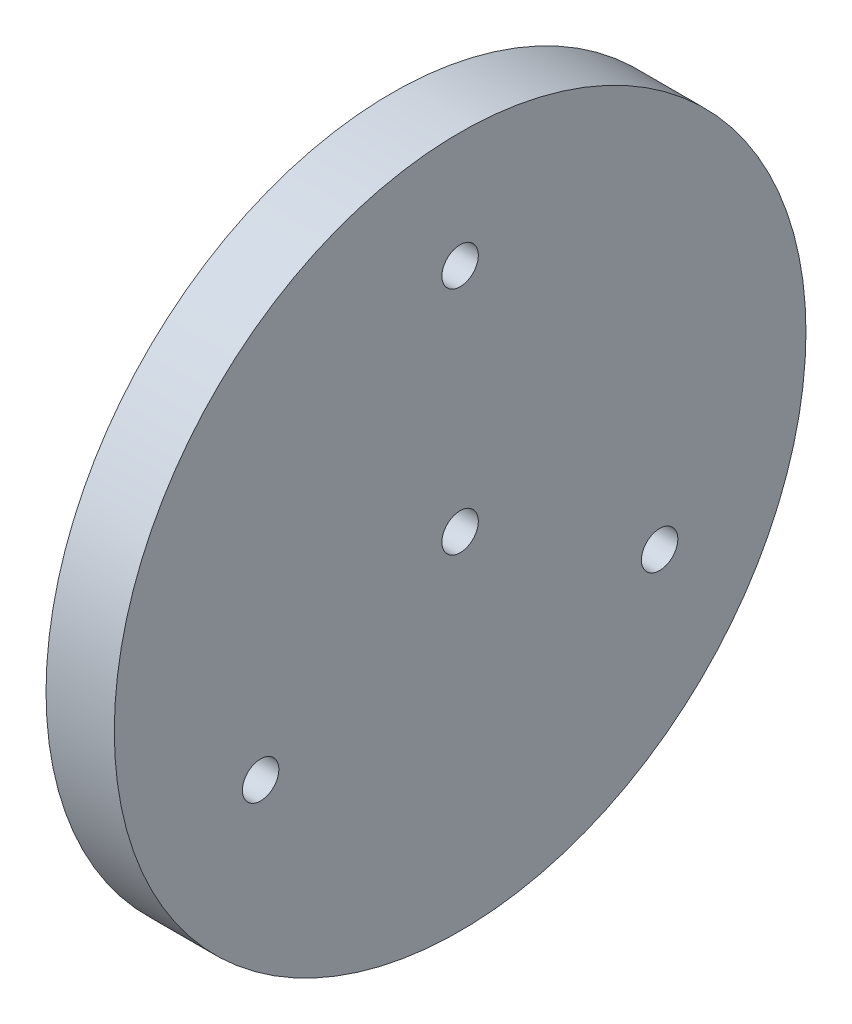
ISO-10303-21;
HEADER;
FILE_DESCRIPTION(('STEP AP214'),'2;1');
FILE_NAME('part.step','',(''),(''),'','','');
FILE_SCHEMA(('AUTOMOTIVE_DESIGN { 1 0 10303 214 1 1 1 1 }'));
ENDSEC;
DATA;
#1=APPLICATION_CONTEXT('core data for automotive mechanical design processes');
#2=APPLICATION_PROTOCOL_DEFINITION('international standard','automotive_design',2000,#1);
#3=PRODUCT_CONTEXT('',#1,'mechanical');
#4=PRODUCT('Part','Part','',(#3));
#5=PRODUCT_RELATED_PRODUCT_CATEGORY('part','',(#4));
#6=PRODUCT_DEFINITION_FORMATION('','',#4);
#7=PRODUCT_DEFINITION_CONTEXT('part definition',#1,'design');
#8=PRODUCT_DEFINITION('design','',#6,#7);
#9=PRODUCT_DEFINITION_SHAPE('','',#8);
#10=(LENGTH_UNIT() NAMED_UNIT(*) SI_UNIT(.MILLI.,.METRE.));
#11=(NAMED_UNIT(*) PLANE_ANGLE_UNIT() SI_UNIT($,.RADIAN.));
#12=(NAMED_UNIT(*) SI_UNIT($,.STERADIAN.) SOLID_ANGLE_UNIT());
#13=UNCERTAINTY_MEASURE_WITH_UNIT(LENGTH_MEASURE(1.E-05),#10,'distance_accuracy_value','');
#14=(GEOMETRIC_REPRESENTATION_CONTEXT(3) GLOBAL_UNCERTAINTY_ASSIGNED_CONTEXT((#13)) GLOBAL_UNIT_ASSIGNED_CONTEXT((#10,
#11,#12)) REPRESENTATION_CONTEXT('',''));
#15=CARTESIAN_POINT('',(0.,0.,0.));
#16=DIRECTION('',(0.,0.,1.));
#17=DIRECTION('',(1.,0.,0.));
#18=AXIS2_PLACEMENT_3D('',#15,#16,#17);
#19=CARTESIAN_POINT('',(15.,0.,0.));
#20=DIRECTION('',(1.,0.,0.));
#21=DIRECTION('',(0.,0.,-1.));
#22=AXIS2_PLACEMENT_3D('',#19,#20,#21);
#23=PLANE('',#22);
#24=CARTESIAN_POINT('',(15.,-25.3097861058362,-43.8378354640156));
#25=DIRECTION('',(1.,0.,0.));
#26=DIRECTION('',(0.,0.,-1.));
#27=AXIS2_PLACEMENT_3D('',#24,#25,#26);
#28=CIRCLE('',#27,4.00000000000277);
#29=CARTESIAN_POINT('',(15.,-25.3097861058362,-47.8378354640183));
#30=VERTEX_POINT('',#29);
#31=EDGE_CURVE('E54',#30,#30,#28,.T.);
#32=ORIENTED_EDGE('',*,*,#31,.F.);
#33=EDGE_LOOP('',(#32));
#34=FACE_BOUND('',#33,.T.);
#35=CARTESIAN_POINT('',(15.,0.,0.));
#36=DIRECTION('',(1.,0.,0.));
#37=DIRECTION('',(0.,0.,-1.));
#38=AXIS2_PLACEMENT_3D('',#35,#36,#37);
#39=CIRCLE('',#38,4.);
#40=CARTESIAN_POINT('',(15.,0.,-4.));
#41=VERTEX_POINT('',#40);
#42=EDGE_CURVE('E43',#41,#41,#39,.T.);
#43=ORIENTED_EDGE('',*,*,#42,.F.);
#44=EDGE_LOOP('',(#43));
#45=FACE_BOUND('',#44,.T.);
#46=CARTESIAN_POINT('',(15.,0.,0.));
#47=DIRECTION('',(1.,0.,0.));
#48=DIRECTION('',(0.,0.,-1.));
#49=AXIS2_PLACEMENT_3D('',#46,#47,#48);
#50=CIRCLE('',#49,76.);
#51=CARTESIAN_POINT('',(15.,0.,-76.));
#52=VERTEX_POINT('',#51);
#53=EDGE_CURVE('E10',#52,#52,#50,.T.);
#54=ORIENTED_EDGE('',*,*,#53,.T.);
#55=EDGE_LOOP('',(#54));
#56=FACE_BOUND('',#55,.T.);
#57=CARTESIAN_POINT('',(15.,50.6195722116761,0.));
#58=DIRECTION('',(1.,0.,0.));
#59=DIRECTION('',(0.,0.,-1.));
#60=AXIS2_PLACEMENT_3D('',#57,#58,#59);
#61=CIRCLE('',#60,4.);
#62=CARTESIAN_POINT('',(15.,50.6195722116761,-4.));
#63=VERTEX_POINT('',#62);
#64=EDGE_CURVE('E48',#63,#63,#61,.T.);
#65=ORIENTED_EDGE('',*,*,#64,.F.);
#66=EDGE_LOOP('',(#65));
#67=FACE_BOUND('',#66,.T.);
#68=CARTESIAN_POINT('',(15.,-25.3097861058399,43.8378354640091));
#69=DIRECTION('',(1.,0.,0.));
#70=DIRECTION('',(0.,0.,-1.));
#71=AXIS2_PLACEMENT_3D('',#68,#69,#70);
#72=CIRCLE('',#71,4.00000000000409);
#73=CARTESIAN_POINT('',(15.,-25.3097861058399,39.837835464005));
#74=VERTEX_POINT('',#73);
#75=EDGE_CURVE('E60',#74,#74,#72,.T.);
#76=ORIENTED_EDGE('',*,*,#75,.F.);
#77=EDGE_LOOP('',(#76));
#78=FACE_BOUND('',#77,.T.);
#79=ADVANCED_FACE('F32',(#34,#45,#56,#67,#78),#23,.T.);
#80=CARTESIAN_POINT('',(0.,0.,0.));
#81=DIRECTION('',(1.,0.,0.));
#82=DIRECTION('',(0.,0.,-1.));
#83=AXIS2_PLACEMENT_3D('',#80,#81,#82);
#84=PLANE('',#83);
#85=CARTESIAN_POINT('',(0.,0.,0.));
#86=DIRECTION('',(1.,0.,0.));
#87=DIRECTION('',(0.,0.,-1.));
#88=AXIS2_PLACEMENT_3D('',#85,#86,#87);
#89=CIRCLE('',#88,76.);
#90=CARTESIAN_POINT('',(0.,0.,-76.));
#91=VERTEX_POINT('',#90);
#92=EDGE_CURVE('E36',#91,#91,#89,.T.);
#93=ORIENTED_EDGE('',*,*,#92,.F.);
#94=EDGE_LOOP('',(#93));
#95=FACE_BOUND('',#94,.T.);
#96=CARTESIAN_POINT('',(0.,0.,0.));
#97=DIRECTION('',(1.,0.,0.));
#98=DIRECTION('',(0.,0.,-1.));
#99=AXIS2_PLACEMENT_3D('',#96,#97,#98);
#100=CIRCLE('',#99,4.);
#101=CARTESIAN_POINT('',(0.,0.,-4.));
#102=VERTEX_POINT('',#101);
#103=EDGE_CURVE('E45',#102,#102,#100,.T.);
#104=ORIENTED_EDGE('',*,*,#103,.T.);
#105=EDGE_LOOP('',(#104));
#106=FACE_BOUND('',#105,.T.);
#107=CARTESIAN_POINT('',(0.,50.6195722116761,0.));
#108=DIRECTION('',(1.,0.,0.));
#109=DIRECTION('',(0.,0.,-1.));
#110=AXIS2_PLACEMENT_3D('',#107,#108,#109);
#111=CIRCLE('',#110,4.);
#112=CARTESIAN_POINT('',(0.,50.6195722116761,-4.));
#113=VERTEX_POINT('',#112);
#114=EDGE_CURVE('E51',#113,#113,#111,.T.);
#115=ORIENTED_EDGE('',*,*,#114,.T.);
#116=EDGE_LOOP('',(#115));
#117=FACE_BOUND('',#116,.T.);
#118=CARTESIAN_POINT('',(0.,-25.3097861058362,-43.8378354640156));
#119=DIRECTION('',(1.,0.,0.));
#120=DIRECTION('',(0.,0.,-1.));
#121=AXIS2_PLACEMENT_3D('',#118,#119,#120);
#122=CIRCLE('',#121,4.00000000000277);
#123=CARTESIAN_POINT('',(0.,-25.3097861058362,-47.8378354640183));
#124=VERTEX_POINT('',#123);
#125=EDGE_CURVE('E57',#124,#124,#122,.T.);
#126=ORIENTED_EDGE('',*,*,#125,.T.);
#127=EDGE_LOOP('',(#126));
#128=FACE_BOUND('',#127,.T.);
#129=CARTESIAN_POINT('',(0.,-25.3097861058399,43.8378354640091));
#130=DIRECTION('',(1.,0.,0.));
#131=DIRECTION('',(0.,0.,-1.));
#132=AXIS2_PLACEMENT_3D('',#129,#130,#131);
#133=CIRCLE('',#132,4.00000000000409);
#134=CARTESIAN_POINT('',(0.,-25.3097861058399,39.837835464005));
#135=VERTEX_POINT('',#134);
#136=EDGE_CURVE('E63',#135,#135,#133,.T.);
#137=ORIENTED_EDGE('',*,*,#136,.T.);
#138=EDGE_LOOP('',(#137));
#139=FACE_BOUND('',#138,.T.);
#140=ADVANCED_FACE('F73',(#95,#106,#117,#128,#139),#84,.F.);
#141=CARTESIAN_POINT('',(15.,0.,0.));
#142=DIRECTION('',(-1.,0.,0.));
#143=DIRECTION('',(0.,0.,1.));
#144=AXIS2_PLACEMENT_3D('',#141,#142,#143);
#145=CYLINDRICAL_SURFACE('',#144,76.);
#146=ORIENTED_EDGE('',*,*,#53,.F.);
#147=EDGE_LOOP('',(#146));
#148=FACE_BOUND('',#147,.T.);
#149=ORIENTED_EDGE('',*,*,#92,.T.);
#150=EDGE_LOOP('',(#149));
#151=FACE_BOUND('',#150,.T.);
#152=ADVANCED_FACE('F34',(#148,#151),#145,.T.);
#153=CARTESIAN_POINT('',(15.,0.,0.));
#154=DIRECTION('',(-1.,0.,0.));
#155=DIRECTION('',(0.,0.,1.));
#156=AXIS2_PLACEMENT_3D('',#153,#154,#155);
#157=CYLINDRICAL_SURFACE('',#156,4.);
#158=ORIENTED_EDGE('',*,*,#42,.T.);
#159=EDGE_LOOP('',(#158));
#160=FACE_BOUND('',#159,.T.);
#161=ORIENTED_EDGE('',*,*,#103,.F.);
#162=EDGE_LOOP('',(#161));
#163=FACE_BOUND('',#162,.T.);
#164=ADVANCED_FACE('F83',(#160,#163),#157,.F.);
#165=CARTESIAN_POINT('',(15.,50.6195722116761,0.));
#166=DIRECTION('',(-1.,0.,0.));
#167=DIRECTION('',(0.,0.,1.));
#168=AXIS2_PLACEMENT_3D('',#165,#166,#167);
#169=CYLINDRICAL_SURFACE('',#168,4.);
#170=ORIENTED_EDGE('',*,*,#64,.T.);
#171=EDGE_LOOP('',(#170));
#172=FACE_BOUND('',#171,.T.);
#173=ORIENTED_EDGE('',*,*,#114,.F.);
#174=EDGE_LOOP('',(#173));
#175=FACE_BOUND('',#174,.T.);
#176=ADVANCED_FACE('F86',(#172,#175),#169,.F.);
#177=CARTESIAN_POINT('',(15.,-25.3097861058362,-43.8378354640156));
#178=DIRECTION('',(-1.,0.,0.));
#179=DIRECTION('',(0.,0.,1.));
#180=AXIS2_PLACEMENT_3D('',#177,#178,#179);
#181=CYLINDRICAL_SURFACE('',#180,4.00000000000277);
#182=ORIENTED_EDGE('',*,*,#31,.T.);
#183=EDGE_LOOP('',(#182));
#184=FACE_BOUND('',#183,.T.);
#185=ORIENTED_EDGE('',*,*,#125,.F.);
#186=EDGE_LOOP('',(#185));
#187=FACE_BOUND('',#186,.T.);
#188=ADVANCED_FACE('F90',(#184,#187),#181,.F.);
#189=CARTESIAN_POINT('',(15.,-25.3097861058399,43.8378354640091));
#190=DIRECTION('',(-1.,0.,0.));
#191=DIRECTION('',(0.,0.,1.));
#192=AXIS2_PLACEMENT_3D('',#189,#190,#191);
#193=CYLINDRICAL_SURFACE('',#192,4.00000000000409);
#194=ORIENTED_EDGE('',*,*,#75,.T.);
#195=EDGE_LOOP('',(#194));
#196=FACE_BOUND('',#195,.T.);
#197=ORIENTED_EDGE('',*,*,#136,.F.);
#198=EDGE_LOOP('',(#197));
#199=FACE_BOUND('',#198,.T.);
#200=ADVANCED_FACE('F69',(#196,#199),#193,.F.);
#201=CLOSED_SHELL('',(#79,#140,#152,#164,#176,#188,#200));
#202=MANIFOLD_SOLID_BREP('B2',#201);
#203=ADVANCED_BREP_SHAPE_REPRESENTATION('',(#18,#202),#14);
#204=SHAPE_DEFINITION_REPRESENTATION(#9,#203);
ENDSEC;
END-ISO-10303-21;
